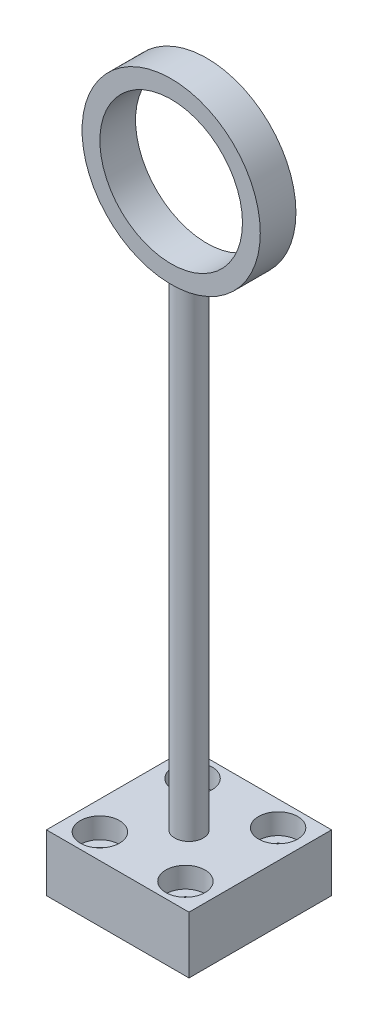
ISO-10303-21;
HEADER;
FILE_DESCRIPTION(('STEP AP214'),'2;1');
FILE_NAME('part.step','',(''),(''),'','','');
FILE_SCHEMA(('AUTOMOTIVE_DESIGN { 1 0 10303 214 1 1 1 1 }'));
ENDSEC;
DATA;
#1=APPLICATION_CONTEXT('core data for automotive mechanical design processes');
#2=APPLICATION_PROTOCOL_DEFINITION('international standard','automotive_design',2000,#1);
#3=PRODUCT_CONTEXT('',#1,'mechanical');
#4=PRODUCT('Part','Part','',(#3));
#5=PRODUCT_RELATED_PRODUCT_CATEGORY('part','',(#4));
#6=PRODUCT_DEFINITION_FORMATION('','',#4);
#7=PRODUCT_DEFINITION_CONTEXT('part definition',#1,'design');
#8=PRODUCT_DEFINITION('design','',#6,#7);
#9=PRODUCT_DEFINITION_SHAPE('','',#8);
#10=(LENGTH_UNIT() NAMED_UNIT(*) SI_UNIT(.MILLI.,.METRE.));
#11=(NAMED_UNIT(*) PLANE_ANGLE_UNIT() SI_UNIT($,.RADIAN.));
#12=(NAMED_UNIT(*) SI_UNIT($,.STERADIAN.) SOLID_ANGLE_UNIT());
#13=UNCERTAINTY_MEASURE_WITH_UNIT(LENGTH_MEASURE(1.E-05),#10,'distance_accuracy_value','');
#14=(GEOMETRIC_REPRESENTATION_CONTEXT(3) GLOBAL_UNCERTAINTY_ASSIGNED_CONTEXT((#13)) GLOBAL_UNIT_ASSIGNED_CONTEXT((#10,
#11,#12)) REPRESENTATION_CONTEXT('',''));
#15=CARTESIAN_POINT('',(0.,0.,0.));
#16=DIRECTION('',(0.,0.,1.));
#17=DIRECTION('',(1.,0.,0.));
#18=AXIS2_PLACEMENT_3D('',#15,#16,#17);
#19=CARTESIAN_POINT('',(0.,0.,5.));
#20=DIRECTION('',(0.,0.,-1.));
#21=DIRECTION('',(-1.,0.,0.));
#22=AXIS2_PLACEMENT_3D('',#19,#20,#21);
#23=CYLINDRICAL_SURFACE('',#22,12.5);
#24=CARTESIAN_POINT('',(0.,0.,5.));
#25=DIRECTION('',(0.,0.,1.));
#26=DIRECTION('',(1.,0.,0.));
#27=AXIS2_PLACEMENT_3D('',#24,#25,#26);
#28=CIRCLE('',#27,12.5);
#29=CARTESIAN_POINT('',(12.5,0.,5.));
#30=VERTEX_POINT('',#29);
#31=EDGE_CURVE('E49',#30,#30,#28,.T.);
#32=ORIENTED_EDGE('',*,*,#31,.F.);
#33=EDGE_LOOP('',(#32));
#34=FACE_BOUND('',#33,.T.);
#35=CARTESIAN_POINT('',(0.,0.,0.));
#36=DIRECTION('',(0.,0.,1.));
#37=DIRECTION('',(1.,0.,0.));
#38=AXIS2_PLACEMENT_3D('',#35,#36,#37);
#39=CIRCLE('',#38,12.5);
#40=CARTESIAN_POINT('',(12.5,0.,0.));
#41=VERTEX_POINT('',#40);
#42=EDGE_CURVE('E125',#41,#41,#39,.T.);
#43=ORIENTED_EDGE('',*,*,#42,.T.);
#44=EDGE_LOOP('',(#43));
#45=FACE_BOUND('',#44,.T.);
#46=CARTESIAN_POINT('',(0.,-12.5,0.5));
#47=CARTESIAN_POINT('',(0.111577020127934,-12.4999981342099,0.500004528630177));
#48=CARTESIAN_POINT('',(0.223216523860334,-12.4984904676373,0.509368607293157));
#49=CARTESIAN_POINT('',(0.443368779658238,-12.4926212341856,0.546564447697981));
#50=CARTESIAN_POINT('',(0.551878486135173,-12.4882569793104,0.574413603900142));
#51=CARTESIAN_POINT('',(0.762553771126288,-12.4771644640129,0.647720880446011));
#52=CARTESIAN_POINT('',(0.864724302944006,-12.4704380773984,0.693165046120791));
#53=CARTESIAN_POINT('',(1.05997584434546,-12.4553623980115,0.800336794397783));
#54=CARTESIAN_POINT('',(1.15305798294893,-12.4470133072085,0.862062350883633));
#55=CARTESIAN_POINT('',(1.32832749604674,-12.4295364290338,1.00062560426243));
#56=CARTESIAN_POINT('',(1.41042286652597,-12.4204030044304,1.07757897894517));
#57=CARTESIAN_POINT('',(1.56059410283783,-12.4024303990938,1.24416446727497));
#58=CARTESIAN_POINT('',(1.62866911690709,-12.393591236265,1.33379735066867));
#59=CARTESIAN_POINT('',(1.74923165413214,-12.377153335782,1.52382388615207));
#60=CARTESIAN_POINT('',(1.80162899846096,-12.369561883485,1.6242754373616));
#61=CARTESIAN_POINT('',(1.88877230962607,-12.3565566594955,1.83269566286881));
#62=CARTESIAN_POINT('',(1.92351937318009,-12.3511427525034,1.94066386963747));
#63=CARTESIAN_POINT('',(1.97408758681328,-12.3431614474236,2.16008037686482));
#64=CARTESIAN_POINT('',(1.990067044504,-12.3405702530036,2.27149131095003));
#65=CARTESIAN_POINT('',(2.00313711337577,-12.3384556715911,2.49544098708544));
#66=CARTESIAN_POINT('',(2.00022895694192,-12.3389320844424,2.60797965507451));
#67=CARTESIAN_POINT('',(1.97573547058135,-12.3428771480604,2.82986503049894));
#68=CARTESIAN_POINT('',(1.95432734726414,-12.3463174079177,2.93923187736104));
#69=CARTESIAN_POINT('',(1.8937194351384,-12.3557581320174,3.15280107109796));
#70=CARTESIAN_POINT('',(1.85451907995672,-12.36175867776,3.2570032534509));
#71=CARTESIAN_POINT('',(1.75925788747207,-12.375674818266,3.45781926785585));
#72=CARTESIAN_POINT('',(1.70312285817509,-12.3835988093069,3.55439729968538));
#73=CARTESIAN_POINT('',(1.57563852632363,-12.4004630811492,3.73683027168534));
#74=CARTESIAN_POINT('',(1.50428809015537,-12.4094034376511,3.82268441212319));
#75=CARTESIAN_POINT('',(1.34742984087892,-12.4274181245254,3.98225880043734));
#76=CARTESIAN_POINT('',(1.26176985545599,-12.4364928200271,4.05582950706879));
#77=CARTESIAN_POINT('',(1.07924037468052,-12.4536592708467,4.18757473884301));
#78=CARTESIAN_POINT('',(0.982370817216381,-12.4617510207175,4.24574917867007));
#79=CARTESIAN_POINT('',(0.780035888309121,-12.4760500569944,4.34506167811398));
#80=CARTESIAN_POINT('',(0.674564267421533,-12.4822559575706,4.38618721726887));
#81=CARTESIAN_POINT('',(0.458089833939771,-12.492072755936,4.45009935792601));
#82=CARTESIAN_POINT('',(0.34708744807073,-12.4956838535962,4.47288737193707));
#83=CARTESIAN_POINT('',(0.12399205540197,-12.4998774645506,4.49927647001296));
#84=CARTESIAN_POINT('',(0.0119239336604378,-12.5004923996757,4.50308296595766));
#85=CARTESIAN_POINT('',(-0.211249371511143,-12.4987129750933,4.49194761839074));
#86=CARTESIAN_POINT('',(-0.322354588854288,-12.4963187218055,4.47700643788865));
#87=CARTESIAN_POINT('',(-0.539818798235508,-12.4888100015234,4.42897070181076));
#88=CARTESIAN_POINT('',(-0.646200674402082,-12.4837106780256,4.39597717469545));
#89=CARTESIAN_POINT('',(-0.851922990585995,-12.4713614614776,4.31288053146995));
#90=CARTESIAN_POINT('',(-0.951263060991192,-12.4641114556453,4.2627765180619));
#91=CARTESIAN_POINT('',(-1.14097865112887,-12.4481852151843,4.14640600069669));
#92=CARTESIAN_POINT('',(-1.2312740030957,-12.4394977755831,4.08001036397693));
#93=CARTESIAN_POINT('',(-1.39951415639528,-12.4216959541371,3.93311984563749));
#94=CARTESIAN_POINT('',(-1.47745813440283,-12.4125815438834,3.85262402487174));
#95=CARTESIAN_POINT('',(-1.61953866530001,-12.3948490273073,3.67889961189604));
#96=CARTESIAN_POINT('',(-1.6835368741472,-12.3862364645378,3.58555722121318));
#97=CARTESIAN_POINT('',(-1.7949448921012,-12.3705841030174,3.38932621887967));
#98=CARTESIAN_POINT('',(-1.84235519623835,-12.3635442573346,3.2864378922229));
#99=CARTESIAN_POINT('',(-1.91903158354154,-12.3518754120478,3.07443304078179));
#100=CARTESIAN_POINT('',(-1.94836814902516,-12.3472370587722,2.96534254540213));
#101=CARTESIAN_POINT('',(-1.9882871855446,-12.3408723222072,2.74370243000799));
#102=CARTESIAN_POINT('',(-1.99887114748454,-12.3391457074239,2.63115308570916));
#103=CARTESIAN_POINT('',(-2.00094546618394,-12.3388093758569,2.40717050656338));
#104=CARTESIAN_POINT('',(-1.99265347821446,-12.3401641282165,2.29573928046024));
#105=CARTESIAN_POINT('',(-1.95768017972975,-12.3457602825821,2.07587867737277));
#106=CARTESIAN_POINT('',(-1.93099891577862,-12.3500016772787,1.96744929278811));
#107=CARTESIAN_POINT('',(-1.86008521855063,-12.3608801586201,1.75674464998353));
#108=CARTESIAN_POINT('',(-1.81587007770134,-12.3675148843103,1.65446344235868));
#109=CARTESIAN_POINT('',(-1.71116577284244,-12.3824349767408,1.45873553232693));
#110=CARTESIAN_POINT('',(-1.65067590624507,-12.3907204147391,1.36528921156177));
#111=CARTESIAN_POINT('',(-1.51435663599677,-12.4081216807701,1.18878141916346));
#112=CARTESIAN_POINT('',(-1.43836664580959,-12.417245602178,1.10584475209959));
#113=CARTESIAN_POINT('',(-1.27354334357953,-12.4352300129975,0.953824618602479));
#114=CARTESIAN_POINT('',(-1.18470706402005,-12.44409044097,0.884744361851291));
#115=CARTESIAN_POINT('',(-0.996048346577333,-12.4606140562915,0.762002533828186));
#116=CARTESIAN_POINT('',(-0.896160049794846,-12.4682693265296,0.708441126112602));
#117=CARTESIAN_POINT('',(-0.688725166968655,-12.4814428750468,0.618938707100922));
#118=CARTESIAN_POINT('',(-0.581186461209754,-12.4869633156233,0.582979856896026));
#119=CARTESIAN_POINT('',(-0.39433551883804,-12.4940175589639,0.537654261264525));
#120=CARTESIAN_POINT('',(-0.316163477498692,-12.4962491778317,0.5235560972072));
#121=CARTESIAN_POINT('',(-0.158671480151704,-12.4992410506714,0.504727427136392));
#122=CARTESIAN_POINT('',(-0.0793515415388275,-12.5000013269159,0.499996779320821));
#123=CARTESIAN_POINT('',(0.,-12.5,0.5));
#124=B_SPLINE_CURVE_WITH_KNOTS('',3,(#46,#47,#48,#49,#50,#51,#52,#53,#54,#55,#56,#57,#58,#59,
#60,#61,#62,#63,#64,#65,#66,#67,#68,#69,#70,#71,#72,#73,#74,#75,#76,#77,#78,#79,#80,#81,#82,#83,
#84,#85,#86,#87,#88,#89,#90,#91,#92,#93,#94,#95,#96,#97,#98,#99,#100,#101,#102,#103,#104,#105,
#106,#107,#108,#109,#110,#111,#112,#113,#114,#115,#116,#117,#118,#119,#120,#121,#122,#123),
.UNSPECIFIED.,.T.,.F.,(4,2,2,2,2,2,2,2,2,2,2,2,2,2,2,2,2,2,2,2,2,2,2,2,2,2,2,2,2,2,2,2,2,2,2,2,
2,2,4),(0.,0.334441046622945,0.669197249319467,1.00368849765685,1.33813814029104,
1.67523334608234,2.0123490250128,2.35136809625945,2.69036609964137,3.0264835846965,
3.36257913887026,3.695490558905,4.02841257712192,4.36281487068318,4.69724208737484,
5.03548313337389,5.37372605363721,5.71221693636019,6.05068174320194,6.38547572150114,
6.72025786018134,7.05318530227047,7.38613020622256,7.72180459283845,8.0575013456327,
8.39639027086604,8.73526908182521,9.07281785760314,9.41033979575026,9.74398956846142,
10.0776384963298,10.4109591848676,10.7442942653298,11.0812763085405,11.4183363199473,
11.7575256865024,12.0963705940352,12.3342225666999,12.5720709388195),.UNSPECIFIED.);
#125=CARTESIAN_POINT('',(0.,-12.5,0.5));
#126=VERTEX_POINT('',#125);
#127=EDGE_CURVE('E11',#126,#126,#124,.T.);
#128=ORIENTED_EDGE('',*,*,#127,.F.);
#129=EDGE_LOOP('',(#128));
#130=FACE_BOUND('',#129,.T.);
#131=ADVANCED_FACE('F36',(#34,#45,#130),#23,.T.);
#132=CARTESIAN_POINT('',(0.,0.,5.));
#133=DIRECTION('',(0.,0.,1.));
#134=DIRECTION('',(1.,0.,0.));
#135=AXIS2_PLACEMENT_3D('',#132,#133,#134);
#136=PLANE('',#135);
#137=ORIENTED_EDGE('',*,*,#31,.T.);
#138=EDGE_LOOP('',(#137));
#139=FACE_BOUND('',#138,.T.);
#140=CARTESIAN_POINT('',(0.,0.,5.));
#141=DIRECTION('',(0.,0.,1.));
#142=DIRECTION('',(1.,0.,0.));
#143=AXIS2_PLACEMENT_3D('',#140,#141,#142);
#144=CIRCLE('',#143,10.);
#145=CARTESIAN_POINT('',(10.,0.,5.));
#146=VERTEX_POINT('',#145);
#147=EDGE_CURVE('E122',#146,#146,#144,.T.);
#148=ORIENTED_EDGE('',*,*,#147,.F.);
#149=EDGE_LOOP('',(#148));
#150=FACE_BOUND('',#149,.T.);
#151=ADVANCED_FACE('F138',(#139,#150),#136,.T.);
#152=CARTESIAN_POINT('',(0.,0.,0.));
#153=DIRECTION('',(0.,0.,1.));
#154=DIRECTION('',(1.,0.,0.));
#155=AXIS2_PLACEMENT_3D('',#152,#153,#154);
#156=PLANE('',#155);
#157=ORIENTED_EDGE('',*,*,#42,.F.);
#158=EDGE_LOOP('',(#157));
#159=FACE_BOUND('',#158,.T.);
#160=CARTESIAN_POINT('',(0.,0.,0.));
#161=DIRECTION('',(0.,0.,1.));
#162=DIRECTION('',(1.,0.,0.));
#163=AXIS2_PLACEMENT_3D('',#160,#161,#162);
#164=CIRCLE('',#163,10.);
#165=CARTESIAN_POINT('',(10.,0.,0.));
#166=VERTEX_POINT('',#165);
#167=EDGE_CURVE('E121',#166,#166,#164,.T.);
#168=ORIENTED_EDGE('',*,*,#167,.T.);
#169=EDGE_LOOP('',(#168));
#170=FACE_BOUND('',#169,.T.);
#171=ADVANCED_FACE('F134',(#159,#170),#156,.F.);
#172=CARTESIAN_POINT('',(0.,0.,5.));
#173=DIRECTION('',(0.,0.,-1.));
#174=DIRECTION('',(-1.,0.,0.));
#175=AXIS2_PLACEMENT_3D('',#172,#173,#174);
#176=CYLINDRICAL_SURFACE('',#175,10.);
#177=ORIENTED_EDGE('',*,*,#147,.T.);
#178=EDGE_LOOP('',(#177));
#179=FACE_BOUND('',#178,.T.);
#180=ORIENTED_EDGE('',*,*,#167,.F.);
#181=EDGE_LOOP('',(#180));
#182=FACE_BOUND('',#181,.T.);
#183=ADVANCED_FACE('F137',(#179,#182),#176,.F.);
#184=CARTESIAN_POINT('',(0.,12.501,2.5));
#185=DIRECTION('',(0.,-1.,0.));
#186=DIRECTION('',(0.,0.,-1.));
#187=AXIS2_PLACEMENT_3D('',#184,#185,#186);
#188=CYLINDRICAL_SURFACE('',#187,2.);
#189=CARTESIAN_POINT('',(0.,-80.,2.5));
#190=DIRECTION('',(0.,1.,0.));
#191=DIRECTION('',(0.,0.,1.));
#192=AXIS2_PLACEMENT_3D('',#189,#190,#191);
#193=CIRCLE('',#192,2.);
#194=CARTESIAN_POINT('',(0.,-80.,4.5));
#195=VERTEX_POINT('',#194);
#196=EDGE_CURVE('E118',#195,#195,#193,.T.);
#197=ORIENTED_EDGE('',*,*,#196,.T.);
#198=EDGE_LOOP('',(#197));
#199=FACE_BOUND('',#198,.T.);
#200=ORIENTED_EDGE('',*,*,#127,.T.);
#201=EDGE_LOOP('',(#200));
#202=FACE_BOUND('',#201,.T.);
#203=ADVANCED_FACE('F142',(#199,#202),#188,.T.);
#204=CARTESIAN_POINT('',(10.,-88.,12.5));
#205=DIRECTION('',(-1.,0.,0.));
#206=DIRECTION('',(0.,0.,1.));
#207=AXIS2_PLACEMENT_3D('',#204,#205,#206);
#208=PLANE('',#207);
#209=DIRECTION('',(0.,0.,1.));
#210=VECTOR('',#209,1.);
#211=CARTESIAN_POINT('',(10.,-80.,12.5));
#212=LINE('',#211,#210);
#213=CARTESIAN_POINT('',(10.,-80.,-7.5));
#214=VERTEX_POINT('',#213);
#215=CARTESIAN_POINT('',(10.,-80.,12.5));
#216=VERTEX_POINT('',#215);
#217=EDGE_CURVE('E108',#214,#216,#212,.T.);
#218=ORIENTED_EDGE('',*,*,#217,.T.);
#219=DIRECTION('',(0.,1.,0.));
#220=VECTOR('',#219,1.);
#221=CARTESIAN_POINT('',(10.,-88.,12.5));
#222=LINE('',#221,#220);
#223=CARTESIAN_POINT('',(10.,-88.,12.5));
#224=VERTEX_POINT('',#223);
#225=EDGE_CURVE('E99',#224,#216,#222,.T.);
#226=ORIENTED_EDGE('',*,*,#225,.F.);
#227=DIRECTION('',(0.,0.,1.));
#228=VECTOR('',#227,1.);
#229=CARTESIAN_POINT('',(10.,-88.,12.5));
#230=LINE('',#229,#228);
#231=CARTESIAN_POINT('',(10.,-88.,-7.5));
#232=VERTEX_POINT('',#231);
#233=EDGE_CURVE('E93',#232,#224,#230,.T.);
#234=ORIENTED_EDGE('',*,*,#233,.F.);
#235=DIRECTION('',(0.,1.,0.));
#236=VECTOR('',#235,1.);
#237=CARTESIAN_POINT('',(10.,-88.,-7.5));
#238=LINE('',#237,#236);
#239=EDGE_CURVE('E104',#232,#214,#238,.T.);
#240=ORIENTED_EDGE('',*,*,#239,.T.);
#241=EDGE_LOOP('',(#218,#226,#234,#240));
#242=FACE_BOUND('',#241,.T.);
#243=ADVANCED_FACE('F148',(#242),#208,.F.);
#244=CARTESIAN_POINT('',(-10.,-88.,12.5));
#245=DIRECTION('',(0.,0.,-1.));
#246=DIRECTION('',(-1.,0.,0.));
#247=AXIS2_PLACEMENT_3D('',#244,#245,#246);
#248=PLANE('',#247);
#249=DIRECTION('',(-1.,0.,0.));
#250=VECTOR('',#249,1.);
#251=CARTESIAN_POINT('',(-10.,-80.,12.5));
#252=LINE('',#251,#250);
#253=CARTESIAN_POINT('',(-10.,-80.,12.5));
#254=VERTEX_POINT('',#253);
#255=EDGE_CURVE('E98',#216,#254,#252,.T.);
#256=ORIENTED_EDGE('',*,*,#255,.T.);
#257=DIRECTION('',(0.,1.,0.));
#258=VECTOR('',#257,1.);
#259=CARTESIAN_POINT('',(-10.,-88.,12.5));
#260=LINE('',#259,#258);
#261=CARTESIAN_POINT('',(-10.,-88.,12.5));
#262=VERTEX_POINT('',#261);
#263=EDGE_CURVE('E96',#262,#254,#260,.T.);
#264=ORIENTED_EDGE('',*,*,#263,.F.);
#265=DIRECTION('',(-1.,0.,0.));
#266=VECTOR('',#265,1.);
#267=CARTESIAN_POINT('',(-10.,-88.,12.5));
#268=LINE('',#267,#266);
#269=EDGE_CURVE('E88',#224,#262,#268,.T.);
#270=ORIENTED_EDGE('',*,*,#269,.F.);
#271=ORIENTED_EDGE('',*,*,#225,.T.);
#272=EDGE_LOOP('',(#256,#264,#270,#271));
#273=FACE_BOUND('',#272,.T.);
#274=ADVANCED_FACE('F97',(#273),#248,.F.);
#275=CARTESIAN_POINT('',(-10.,-88.,12.5));
#276=DIRECTION('',(1.,0.,0.));
#277=DIRECTION('',(0.,0.,-1.));
#278=AXIS2_PLACEMENT_3D('',#275,#276,#277);
#279=PLANE('',#278);
#280=DIRECTION('',(0.,0.,-1.));
#281=VECTOR('',#280,1.);
#282=CARTESIAN_POINT('',(-10.,-80.,12.5));
#283=LINE('',#282,#281);
#284=CARTESIAN_POINT('',(-10.,-80.,-7.5));
#285=VERTEX_POINT('',#284);
#286=EDGE_CURVE('E74',#254,#285,#283,.T.);
#287=ORIENTED_EDGE('',*,*,#286,.T.);
#288=DIRECTION('',(0.,1.,0.));
#289=VECTOR('',#288,1.);
#290=CARTESIAN_POINT('',(-10.,-88.,-7.5));
#291=LINE('',#290,#289);
#292=CARTESIAN_POINT('',(-10.,-88.,-7.5));
#293=VERTEX_POINT('',#292);
#294=EDGE_CURVE('E100',#293,#285,#291,.T.);
#295=ORIENTED_EDGE('',*,*,#294,.F.);
#296=DIRECTION('',(0.,0.,-1.));
#297=VECTOR('',#296,1.);
#298=CARTESIAN_POINT('',(-10.,-88.,12.5));
#299=LINE('',#298,#297);
#300=EDGE_CURVE('E91',#262,#293,#299,.T.);
#301=ORIENTED_EDGE('',*,*,#300,.F.);
#302=ORIENTED_EDGE('',*,*,#263,.T.);
#303=EDGE_LOOP('',(#287,#295,#301,#302));
#304=FACE_BOUND('',#303,.T.);
#305=ADVANCED_FACE('F102',(#304),#279,.F.);
#306=CARTESIAN_POINT('',(-10.,-88.,-7.5));
#307=DIRECTION('',(0.,0.,1.));
#308=DIRECTION('',(1.,0.,0.));
#309=AXIS2_PLACEMENT_3D('',#306,#307,#308);
#310=PLANE('',#309);
#311=DIRECTION('',(1.,0.,0.));
#312=VECTOR('',#311,1.);
#313=CARTESIAN_POINT('',(-10.,-80.,-7.5));
#314=LINE('',#313,#312);
#315=EDGE_CURVE('E80',#285,#214,#314,.T.);
#316=ORIENTED_EDGE('',*,*,#315,.T.);
#317=ORIENTED_EDGE('',*,*,#239,.F.);
#318=DIRECTION('',(1.,0.,0.));
#319=VECTOR('',#318,1.);
#320=CARTESIAN_POINT('',(-10.,-88.,-7.5));
#321=LINE('',#320,#319);
#322=EDGE_CURVE('E57',#293,#232,#321,.T.);
#323=ORIENTED_EDGE('',*,*,#322,.F.);
#324=ORIENTED_EDGE('',*,*,#294,.T.);
#325=EDGE_LOOP('',(#316,#317,#323,#324));
#326=FACE_BOUND('',#325,.T.);
#327=ADVANCED_FACE('F206',(#326),#310,.F.);
#328=CARTESIAN_POINT('',(0.,-88.,0.));
#329=DIRECTION('',(0.,-1.,0.));
#330=DIRECTION('',(0.,0.,-1.));
#331=AXIS2_PLACEMENT_3D('',#328,#329,#330);
#332=PLANE('',#331);
#333=CARTESIAN_POINT('',(-6.,-88.,-4.));
#334=DIRECTION('',(0.,1.,0.));
#335=DIRECTION('',(0.,0.,1.));
#336=AXIS2_PLACEMENT_3D('',#333,#334,#335);
#337=CIRCLE('',#336,1.45);
#338=CARTESIAN_POINT('',(-6.,-88.,-2.55));
#339=VERTEX_POINT('',#338);
#340=EDGE_CURVE('E371',#339,#339,#337,.T.);
#341=ORIENTED_EDGE('',*,*,#340,.T.);
#342=EDGE_LOOP('',(#341));
#343=FACE_BOUND('',#342,.T.);
#344=CARTESIAN_POINT('',(6.,-88.,-4.));
#345=DIRECTION('',(0.,1.,0.));
#346=DIRECTION('',(0.,0.,1.));
#347=AXIS2_PLACEMENT_3D('',#344,#345,#346);
#348=CIRCLE('',#347,1.45);
#349=CARTESIAN_POINT('',(6.,-88.,-2.55));
#350=VERTEX_POINT('',#349);
#351=EDGE_CURVE('E383',#350,#350,#348,.T.);
#352=ORIENTED_EDGE('',*,*,#351,.T.);
#353=EDGE_LOOP('',(#352));
#354=FACE_BOUND('',#353,.T.);
#355=CARTESIAN_POINT('',(6.,-88.,9.));
#356=DIRECTION('',(0.,1.,0.));
#357=DIRECTION('',(0.,0.,1.));
#358=AXIS2_PLACEMENT_3D('',#355,#356,#357);
#359=CIRCLE('',#358,1.45);
#360=CARTESIAN_POINT('',(6.,-88.,10.45));
#361=VERTEX_POINT('',#360);
#362=EDGE_CURVE('E395',#361,#361,#359,.T.);
#363=ORIENTED_EDGE('',*,*,#362,.T.);
#364=EDGE_LOOP('',(#363));
#365=FACE_BOUND('',#364,.T.);
#366=CARTESIAN_POINT('',(-6.,-88.,9.));
#367=DIRECTION('',(0.,1.,0.));
#368=DIRECTION('',(0.,0.,1.));
#369=AXIS2_PLACEMENT_3D('',#366,#367,#368);
#370=CIRCLE('',#369,1.45);
#371=CARTESIAN_POINT('',(-6.,-88.,10.45));
#372=VERTEX_POINT('',#371);
#373=EDGE_CURVE('E111',#372,#372,#370,.T.);
#374=ORIENTED_EDGE('',*,*,#373,.T.);
#375=EDGE_LOOP('',(#374));
#376=FACE_BOUND('',#375,.T.);
#377=ORIENTED_EDGE('',*,*,#233,.T.);
#378=ORIENTED_EDGE('',*,*,#269,.T.);
#379=ORIENTED_EDGE('',*,*,#300,.T.);
#380=ORIENTED_EDGE('',*,*,#322,.T.);
#381=EDGE_LOOP('',(#377,#378,#379,#380));
#382=FACE_BOUND('',#381,.T.);
#383=ADVANCED_FACE('F89',(#343,#354,#365,#376,#382),#332,.T.);
#384=CARTESIAN_POINT('',(0.,-80.,0.));
#385=DIRECTION('',(0.,-1.,0.));
#386=DIRECTION('',(0.,0.,-1.));
#387=AXIS2_PLACEMENT_3D('',#384,#385,#386);
#388=PLANE('',#387);
#389=CARTESIAN_POINT('',(-6.,-80.,-4.));
#390=DIRECTION('',(0.,1.,0.));
#391=DIRECTION('',(0.,0.,1.));
#392=AXIS2_PLACEMENT_3D('',#389,#390,#391);
#393=CIRCLE('',#392,2.75);
#394=CARTESIAN_POINT('',(-6.,-80.,-1.25));
#395=VERTEX_POINT('',#394);
#396=EDGE_CURVE('E364',#395,#395,#393,.T.);
#397=ORIENTED_EDGE('',*,*,#396,.F.);
#398=EDGE_LOOP('',(#397));
#399=FACE_BOUND('',#398,.T.);
#400=CARTESIAN_POINT('',(6.,-80.,-4.));
#401=DIRECTION('',(0.,1.,0.));
#402=DIRECTION('',(0.,0.,1.));
#403=AXIS2_PLACEMENT_3D('',#400,#401,#402);
#404=CIRCLE('',#403,2.75);
#405=CARTESIAN_POINT('',(6.,-80.,-1.25));
#406=VERTEX_POINT('',#405);
#407=EDGE_CURVE('E374',#406,#406,#404,.T.);
#408=ORIENTED_EDGE('',*,*,#407,.F.);
#409=EDGE_LOOP('',(#408));
#410=FACE_BOUND('',#409,.T.);
#411=CARTESIAN_POINT('',(6.,-80.,9.));
#412=DIRECTION('',(0.,1.,0.));
#413=DIRECTION('',(0.,0.,1.));
#414=AXIS2_PLACEMENT_3D('',#411,#412,#413);
#415=CIRCLE('',#414,2.75);
#416=CARTESIAN_POINT('',(6.,-80.,11.75));
#417=VERTEX_POINT('',#416);
#418=EDGE_CURVE('E386',#417,#417,#415,.T.);
#419=ORIENTED_EDGE('',*,*,#418,.F.);
#420=EDGE_LOOP('',(#419));
#421=FACE_BOUND('',#420,.T.);
#422=CARTESIAN_POINT('',(-6.,-80.,9.));
#423=DIRECTION('',(0.,1.,0.));
#424=DIRECTION('',(0.,0.,1.));
#425=AXIS2_PLACEMENT_3D('',#422,#423,#424);
#426=CIRCLE('',#425,2.75);
#427=CARTESIAN_POINT('',(-6.,-80.,11.75));
#428=VERTEX_POINT('',#427);
#429=EDGE_CURVE('E398',#428,#428,#426,.T.);
#430=ORIENTED_EDGE('',*,*,#429,.F.);
#431=EDGE_LOOP('',(#430));
#432=FACE_BOUND('',#431,.T.);
#433=ORIENTED_EDGE('',*,*,#196,.F.);
#434=EDGE_LOOP('',(#433));
#435=FACE_BOUND('',#434,.T.);
#436=ORIENTED_EDGE('',*,*,#217,.F.);
#437=ORIENTED_EDGE('',*,*,#315,.F.);
#438=ORIENTED_EDGE('',*,*,#286,.F.);
#439=ORIENTED_EDGE('',*,*,#255,.F.);
#440=EDGE_LOOP('',(#436,#437,#438,#439));
#441=FACE_BOUND('',#440,.T.);
#442=ADVANCED_FACE('F223',(#399,#410,#421,#432,#435,#441),#388,.F.);
#443=CARTESIAN_POINT('',(-6.,-80.,9.));
#444=DIRECTION('',(0.,1.,0.));
#445=DIRECTION('',(0.,0.,1.));
#446=AXIS2_PLACEMENT_3D('',#443,#444,#445);
#447=CYLINDRICAL_SURFACE('',#446,1.45);
#448=ORIENTED_EDGE('',*,*,#373,.F.);
#449=EDGE_LOOP('',(#448));
#450=FACE_BOUND('',#449,.T.);
#451=CARTESIAN_POINT('',(-6.,-82.9,9.));
#452=DIRECTION('',(0.,1.,0.));
#453=DIRECTION('',(0.,0.,1.));
#454=AXIS2_PLACEMENT_3D('',#451,#452,#453);
#455=CIRCLE('',#454,1.45);
#456=CARTESIAN_POINT('',(-6.,-82.9,10.45));
#457=VERTEX_POINT('',#456);
#458=EDGE_CURVE('E404',#457,#457,#455,.T.);
#459=ORIENTED_EDGE('',*,*,#458,.T.);
#460=EDGE_LOOP('',(#459));
#461=FACE_BOUND('',#460,.T.);
#462=ADVANCED_FACE('F233',(#450,#461),#447,.F.);
#463=CARTESIAN_POINT('',(-4.55,-82.9,9.));
#464=DIRECTION('',(0.,-1.,0.));
#465=DIRECTION('',(0.,0.,-1.));
#466=AXIS2_PLACEMENT_3D('',#463,#464,#465);
#467=PLANE('',#466);
#468=ORIENTED_EDGE('',*,*,#458,.F.);
#469=EDGE_LOOP('',(#468));
#470=FACE_BOUND('',#469,.T.);
#471=CARTESIAN_POINT('',(-6.,-82.9,9.));
#472=DIRECTION('',(0.,1.,0.));
#473=DIRECTION('',(0.,0.,1.));
#474=AXIS2_PLACEMENT_3D('',#471,#472,#473);
#475=CIRCLE('',#474,2.75);
#476=CARTESIAN_POINT('',(-6.,-82.9,11.75));
#477=VERTEX_POINT('',#476);
#478=EDGE_CURVE('E401',#477,#477,#475,.T.);
#479=ORIENTED_EDGE('',*,*,#478,.T.);
#480=EDGE_LOOP('',(#479));
#481=FACE_BOUND('',#480,.T.);
#482=ADVANCED_FACE('F243',(#470,#481),#467,.F.);
#483=CARTESIAN_POINT('',(-6.,-80.,9.));
#484=DIRECTION('',(0.,1.,0.));
#485=DIRECTION('',(0.,0.,1.));
#486=AXIS2_PLACEMENT_3D('',#483,#484,#485);
#487=CYLINDRICAL_SURFACE('',#486,2.75);
#488=ORIENTED_EDGE('',*,*,#478,.F.);
#489=EDGE_LOOP('',(#488));
#490=FACE_BOUND('',#489,.T.);
#491=ORIENTED_EDGE('',*,*,#429,.T.);
#492=EDGE_LOOP('',(#491));
#493=FACE_BOUND('',#492,.T.);
#494=ADVANCED_FACE('F253',(#490,#493),#487,.F.);
#495=CARTESIAN_POINT('',(6.,-80.,9.));
#496=DIRECTION('',(0.,1.,0.));
#497=DIRECTION('',(0.,0.,1.));
#498=AXIS2_PLACEMENT_3D('',#495,#496,#497);
#499=CYLINDRICAL_SURFACE('',#498,1.45);
#500=ORIENTED_EDGE('',*,*,#362,.F.);
#501=EDGE_LOOP('',(#500));
#502=FACE_BOUND('',#501,.T.);
#503=CARTESIAN_POINT('',(6.,-82.9,9.));
#504=DIRECTION('',(0.,1.,0.));
#505=DIRECTION('',(0.,0.,1.));
#506=AXIS2_PLACEMENT_3D('',#503,#504,#505);
#507=CIRCLE('',#506,1.45);
#508=CARTESIAN_POINT('',(6.,-82.9,10.45));
#509=VERTEX_POINT('',#508);
#510=EDGE_CURVE('E392',#509,#509,#507,.T.);
#511=ORIENTED_EDGE('',*,*,#510,.T.);
#512=EDGE_LOOP('',(#511));
#513=FACE_BOUND('',#512,.T.);
#514=ADVANCED_FACE('F263',(#502,#513),#499,.F.);
#515=CARTESIAN_POINT('',(7.45,-82.9,9.));
#516=DIRECTION('',(0.,-1.,0.));
#517=DIRECTION('',(0.,0.,-1.));
#518=AXIS2_PLACEMENT_3D('',#515,#516,#517);
#519=PLANE('',#518);
#520=ORIENTED_EDGE('',*,*,#510,.F.);
#521=EDGE_LOOP('',(#520));
#522=FACE_BOUND('',#521,.T.);
#523=CARTESIAN_POINT('',(6.,-82.9,9.));
#524=DIRECTION('',(0.,1.,0.));
#525=DIRECTION('',(0.,0.,1.));
#526=AXIS2_PLACEMENT_3D('',#523,#524,#525);
#527=CIRCLE('',#526,2.75);
#528=CARTESIAN_POINT('',(6.,-82.9,11.75));
#529=VERTEX_POINT('',#528);
#530=EDGE_CURVE('E389',#529,#529,#527,.T.);
#531=ORIENTED_EDGE('',*,*,#530,.T.);
#532=EDGE_LOOP('',(#531));
#533=FACE_BOUND('',#532,.T.);
#534=ADVANCED_FACE('F273',(#522,#533),#519,.F.);
#535=CARTESIAN_POINT('',(6.,-80.,9.));
#536=DIRECTION('',(0.,1.,0.));
#537=DIRECTION('',(0.,0.,1.));
#538=AXIS2_PLACEMENT_3D('',#535,#536,#537);
#539=CYLINDRICAL_SURFACE('',#538,2.75);
#540=ORIENTED_EDGE('',*,*,#530,.F.);
#541=EDGE_LOOP('',(#540));
#542=FACE_BOUND('',#541,.T.);
#543=ORIENTED_EDGE('',*,*,#418,.T.);
#544=EDGE_LOOP('',(#543));
#545=FACE_BOUND('',#544,.T.);
#546=ADVANCED_FACE('F283',(#542,#545),#539,.F.);
#547=CARTESIAN_POINT('',(6.,-80.,-4.));
#548=DIRECTION('',(0.,1.,0.));
#549=DIRECTION('',(0.,0.,1.));
#550=AXIS2_PLACEMENT_3D('',#547,#548,#549);
#551=CYLINDRICAL_SURFACE('',#550,1.45);
#552=ORIENTED_EDGE('',*,*,#351,.F.);
#553=EDGE_LOOP('',(#552));
#554=FACE_BOUND('',#553,.T.);
#555=CARTESIAN_POINT('',(6.,-82.9,-4.));
#556=DIRECTION('',(0.,1.,0.));
#557=DIRECTION('',(0.,0.,1.));
#558=AXIS2_PLACEMENT_3D('',#555,#556,#557);
#559=CIRCLE('',#558,1.45);
#560=CARTESIAN_POINT('',(6.,-82.9,-2.55));
#561=VERTEX_POINT('',#560);
#562=EDGE_CURVE('E380',#561,#561,#559,.T.);
#563=ORIENTED_EDGE('',*,*,#562,.T.);
#564=EDGE_LOOP('',(#563));
#565=FACE_BOUND('',#564,.T.);
#566=ADVANCED_FACE('F293',(#554,#565),#551,.F.);
#567=CARTESIAN_POINT('',(7.45,-82.9,-4.));
#568=DIRECTION('',(0.,-1.,0.));
#569=DIRECTION('',(0.,0.,-1.));
#570=AXIS2_PLACEMENT_3D('',#567,#568,#569);
#571=PLANE('',#570);
#572=ORIENTED_EDGE('',*,*,#562,.F.);
#573=EDGE_LOOP('',(#572));
#574=FACE_BOUND('',#573,.T.);
#575=CARTESIAN_POINT('',(6.,-82.9,-4.));
#576=DIRECTION('',(0.,1.,0.));
#577=DIRECTION('',(0.,0.,1.));
#578=AXIS2_PLACEMENT_3D('',#575,#576,#577);
#579=CIRCLE('',#578,2.75);
#580=CARTESIAN_POINT('',(6.,-82.9,-1.25));
#581=VERTEX_POINT('',#580);
#582=EDGE_CURVE('E377',#581,#581,#579,.T.);
#583=ORIENTED_EDGE('',*,*,#582,.T.);
#584=EDGE_LOOP('',(#583));
#585=FACE_BOUND('',#584,.T.);
#586=ADVANCED_FACE('F303',(#574,#585),#571,.F.);
#587=CARTESIAN_POINT('',(6.,-80.,-4.));
#588=DIRECTION('',(0.,1.,0.));
#589=DIRECTION('',(0.,0.,1.));
#590=AXIS2_PLACEMENT_3D('',#587,#588,#589);
#591=CYLINDRICAL_SURFACE('',#590,2.75);
#592=ORIENTED_EDGE('',*,*,#582,.F.);
#593=EDGE_LOOP('',(#592));
#594=FACE_BOUND('',#593,.T.);
#595=ORIENTED_EDGE('',*,*,#407,.T.);
#596=EDGE_LOOP('',(#595));
#597=FACE_BOUND('',#596,.T.);
#598=ADVANCED_FACE('F313',(#594,#597),#591,.F.);
#599=CARTESIAN_POINT('',(-6.,-80.,-4.));
#600=DIRECTION('',(0.,1.,0.));
#601=DIRECTION('',(0.,0.,1.));
#602=AXIS2_PLACEMENT_3D('',#599,#600,#601);
#603=CYLINDRICAL_SURFACE('',#602,1.45);
#604=ORIENTED_EDGE('',*,*,#340,.F.);
#605=EDGE_LOOP('',(#604));
#606=FACE_BOUND('',#605,.T.);
#607=CARTESIAN_POINT('',(-6.,-82.9,-4.));
#608=DIRECTION('',(0.,1.,0.));
#609=DIRECTION('',(0.,0.,1.));
#610=AXIS2_PLACEMENT_3D('',#607,#608,#609);
#611=CIRCLE('',#610,1.45);
#612=CARTESIAN_POINT('',(-6.,-82.9,-2.55));
#613=VERTEX_POINT('',#612);
#614=EDGE_CURVE('E366',#613,#613,#611,.T.);
#615=ORIENTED_EDGE('',*,*,#614,.T.);
#616=EDGE_LOOP('',(#615));
#617=FACE_BOUND('',#616,.T.);
#618=ADVANCED_FACE('F323',(#606,#617),#603,.F.);
#619=CARTESIAN_POINT('',(-4.55,-82.9,-4.));
#620=DIRECTION('',(0.,-1.,0.));
#621=DIRECTION('',(0.,0.,-1.));
#622=AXIS2_PLACEMENT_3D('',#619,#620,#621);
#623=PLANE('',#622);
#624=ORIENTED_EDGE('',*,*,#614,.F.);
#625=EDGE_LOOP('',(#624));
#626=FACE_BOUND('',#625,.T.);
#627=CARTESIAN_POINT('',(-6.,-82.9,-4.));
#628=DIRECTION('',(0.,1.,0.));
#629=DIRECTION('',(0.,0.,1.));
#630=AXIS2_PLACEMENT_3D('',#627,#628,#629);
#631=CIRCLE('',#630,2.75);
#632=CARTESIAN_POINT('',(-6.,-82.9,-1.25));
#633=VERTEX_POINT('',#632);
#634=EDGE_CURVE('E361',#633,#633,#631,.T.);
#635=ORIENTED_EDGE('',*,*,#634,.T.);
#636=EDGE_LOOP('',(#635));
#637=FACE_BOUND('',#636,.T.);
#638=ADVANCED_FACE('F333',(#626,#637),#623,.F.);
#639=CARTESIAN_POINT('',(-6.,-80.,-4.));
#640=DIRECTION('',(0.,1.,0.));
#641=DIRECTION('',(0.,0.,1.));
#642=AXIS2_PLACEMENT_3D('',#639,#640,#641);
#643=CYLINDRICAL_SURFACE('',#642,2.75);
#644=ORIENTED_EDGE('',*,*,#634,.F.);
#645=EDGE_LOOP('',(#644));
#646=FACE_BOUND('',#645,.T.);
#647=ORIENTED_EDGE('',*,*,#396,.T.);
#648=EDGE_LOOP('',(#647));
#649=FACE_BOUND('',#648,.T.);
#650=ADVANCED_FACE('F343',(#646,#649),#643,.F.);
#651=CLOSED_SHELL('',(#131,#151,#171,#183,#203,#243,#274,#305,#327,#383,#442,#462,#482,#494,
#514,#534,#546,#566,#586,#598,#618,#638,#650));
#652=MANIFOLD_SOLID_BREP('B2',#651);
#653=ADVANCED_BREP_SHAPE_REPRESENTATION('',(#18,#652),#14);
#654=SHAPE_DEFINITION_REPRESENTATION(#9,#653);
ENDSEC;
END-ISO-10303-21;
